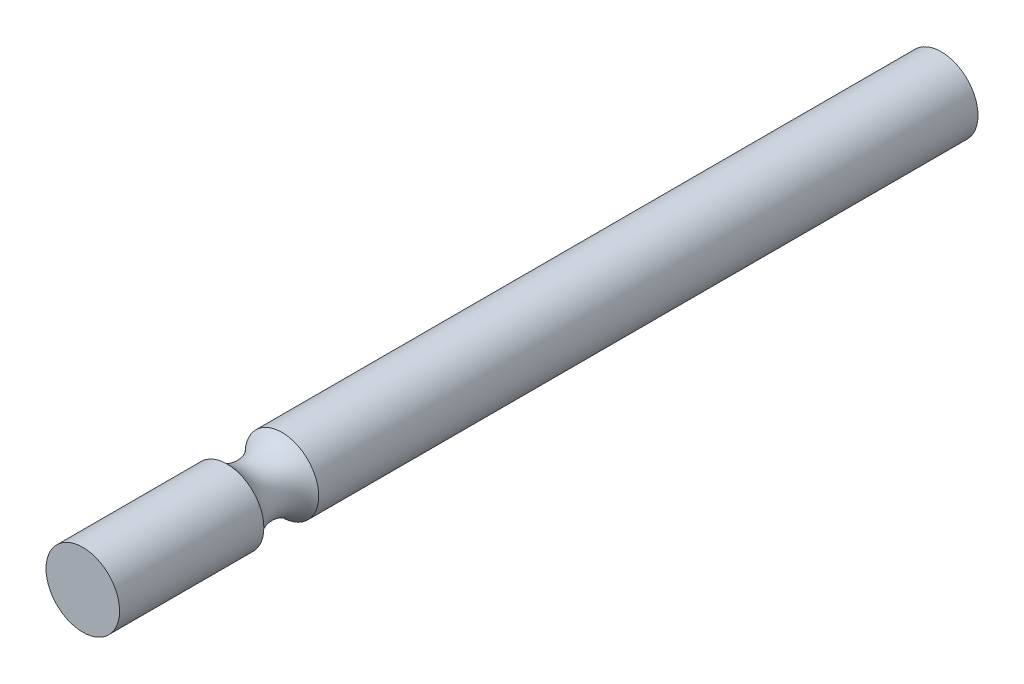
ISO-10303-21;
HEADER;
FILE_DESCRIPTION(('STEP AP214'),'2;1');
FILE_NAME('part.step','',(''),(''),'','','');
FILE_SCHEMA(('AUTOMOTIVE_DESIGN { 1 0 10303 214 1 1 1 1 }'));
ENDSEC;
DATA;
#1=APPLICATION_CONTEXT('core data for automotive mechanical design processes');
#2=APPLICATION_PROTOCOL_DEFINITION('international standard','automotive_design',2000,#1);
#3=PRODUCT_CONTEXT('',#1,'mechanical');
#4=PRODUCT('Part','Part','',(#3));
#5=PRODUCT_RELATED_PRODUCT_CATEGORY('part','',(#4));
#6=PRODUCT_DEFINITION_FORMATION('','',#4);
#7=PRODUCT_DEFINITION_CONTEXT('part definition',#1,'design');
#8=PRODUCT_DEFINITION('design','',#6,#7);
#9=PRODUCT_DEFINITION_SHAPE('','',#8);
#10=(LENGTH_UNIT() NAMED_UNIT(*) SI_UNIT(.MILLI.,.METRE.));
#11=(NAMED_UNIT(*) PLANE_ANGLE_UNIT() SI_UNIT($,.RADIAN.));
#12=(NAMED_UNIT(*) SI_UNIT($,.STERADIAN.) SOLID_ANGLE_UNIT());
#13=UNCERTAINTY_MEASURE_WITH_UNIT(LENGTH_MEASURE(1.E-05),#10,'distance_accuracy_value','');
#14=(GEOMETRIC_REPRESENTATION_CONTEXT(3) GLOBAL_UNCERTAINTY_ASSIGNED_CONTEXT((#13)) GLOBAL_UNIT_ASSIGNED_CONTEXT((#10,
#11,#12)) REPRESENTATION_CONTEXT('',''));
#15=CARTESIAN_POINT('',(0.,0.,0.));
#16=DIRECTION('',(0.,0.,1.));
#17=DIRECTION('',(1.,0.,0.));
#18=AXIS2_PLACEMENT_3D('',#15,#16,#17);
#19=CARTESIAN_POINT('',(0.,0.,35.));
#20=DIRECTION('',(0.,0.,-1.));
#21=DIRECTION('',(-1.,0.,0.));
#22=AXIS2_PLACEMENT_3D('',#19,#20,#21);
#23=CYLINDRICAL_SURFACE('',#22,1.5);
#24=CARTESIAN_POINT('',(0.,0.,35.));
#25=DIRECTION('',(0.,0.,1.));
#26=DIRECTION('',(1.,0.,0.));
#27=AXIS2_PLACEMENT_3D('',#24,#25,#26);
#28=CIRCLE('',#27,1.5);
#29=CARTESIAN_POINT('',(1.5,0.,35.));
#30=VERTEX_POINT('',#29);
#31=EDGE_CURVE('E10',#30,#30,#28,.T.);
#32=ORIENTED_EDGE('',*,*,#31,.F.);
#33=EDGE_LOOP('',(#32));
#34=FACE_BOUND('',#33,.T.);
#35=CARTESIAN_POINT('',(0.,0.,29.1180339887499));
#36=DIRECTION('',(0.,0.,-1.));
#37=DIRECTION('',(-1.,0.,0.));
#38=AXIS2_PLACEMENT_3D('',#35,#36,#37);
#39=CIRCLE('',#38,1.5);
#40=CARTESIAN_POINT('',(-1.5,0.,29.1180339887499));
#41=VERTEX_POINT('',#40);
#42=EDGE_CURVE('E39',#41,#41,#39,.T.);
#43=ORIENTED_EDGE('',*,*,#42,.F.);
#44=EDGE_LOOP('',(#43));
#45=FACE_BOUND('',#44,.T.);
#46=ADVANCED_FACE('F36',(#34,#45),#23,.T.);
#47=CARTESIAN_POINT('',(0.,0.,35.));
#48=DIRECTION('',(0.,0.,1.));
#49=DIRECTION('',(1.,0.,0.));
#50=AXIS2_PLACEMENT_3D('',#47,#48,#49);
#51=PLANE('',#50);
#52=ORIENTED_EDGE('',*,*,#31,.T.);
#53=EDGE_LOOP('',(#52));
#54=FACE_BOUND('',#53,.T.);
#55=ADVANCED_FACE('F59',(#54),#51,.T.);
#56=CARTESIAN_POINT('',(0.,0.,28.));
#57=DIRECTION('',(0.,0.,1.));
#58=DIRECTION('',(1.,0.,0.));
#59=AXIS2_PLACEMENT_3D('',#56,#57,#58);
#60=TOROIDAL_SURFACE('',#59,2.5,1.5);
#61=CARTESIAN_POINT('',(0.,0.,26.8819660112501));
#62=DIRECTION('',(0.,0.,1.));
#63=DIRECTION('',(1.,0.,0.));
#64=AXIS2_PLACEMENT_3D('',#61,#62,#63);
#65=CIRCLE('',#64,1.5);
#66=CARTESIAN_POINT('',(1.5,0.,26.8819660112501));
#67=VERTEX_POINT('',#66);
#68=EDGE_CURVE('E49',#67,#67,#65,.T.);
#69=ORIENTED_EDGE('',*,*,#68,.T.);
#70=EDGE_LOOP('',(#69));
#71=FACE_BOUND('',#70,.T.);
#72=ORIENTED_EDGE('',*,*,#42,.T.);
#73=EDGE_LOOP('',(#72));
#74=FACE_BOUND('',#73,.T.);
#75=ADVANCED_FACE('F56',(#71,#74),#60,.F.);
#76=CARTESIAN_POINT('',(0.,0.,0.));
#77=DIRECTION('',(0.,0.,1.));
#78=DIRECTION('',(1.,0.,0.));
#79=AXIS2_PLACEMENT_3D('',#76,#77,#78);
#80=PLANE('',#79);
#81=CARTESIAN_POINT('',(0.,0.,0.));
#82=DIRECTION('',(0.,0.,1.));
#83=DIRECTION('',(1.,0.,0.));
#84=AXIS2_PLACEMENT_3D('',#81,#82,#83);
#85=CIRCLE('',#84,1.5);
#86=CARTESIAN_POINT('',(1.5,0.,0.));
#87=VERTEX_POINT('',#86);
#88=EDGE_CURVE('E43',#87,#87,#85,.T.);
#89=ORIENTED_EDGE('',*,*,#88,.F.);
#90=EDGE_LOOP('',(#89));
#91=FACE_BOUND('',#90,.T.);
#92=ADVANCED_FACE('F67',(#91),#80,.F.);
#93=ORIENTED_EDGE('',*,*,#88,.T.);
#94=EDGE_LOOP('',(#93));
#95=FACE_BOUND('',#94,.T.);
#96=ORIENTED_EDGE('',*,*,#68,.F.);
#97=EDGE_LOOP('',(#96));
#98=FACE_BOUND('',#97,.T.);
#99=ADVANCED_FACE('F61',(#95,#98),#23,.T.);
#100=CLOSED_SHELL('',(#46,#55,#75,#92,#99));
#101=MANIFOLD_SOLID_BREP('B2',#100);
#102=ADVANCED_BREP_SHAPE_REPRESENTATION('',(#18,#101),#14);
#103=SHAPE_DEFINITION_REPRESENTATION(#9,#102);
ENDSEC;
END-ISO-10303-21;
